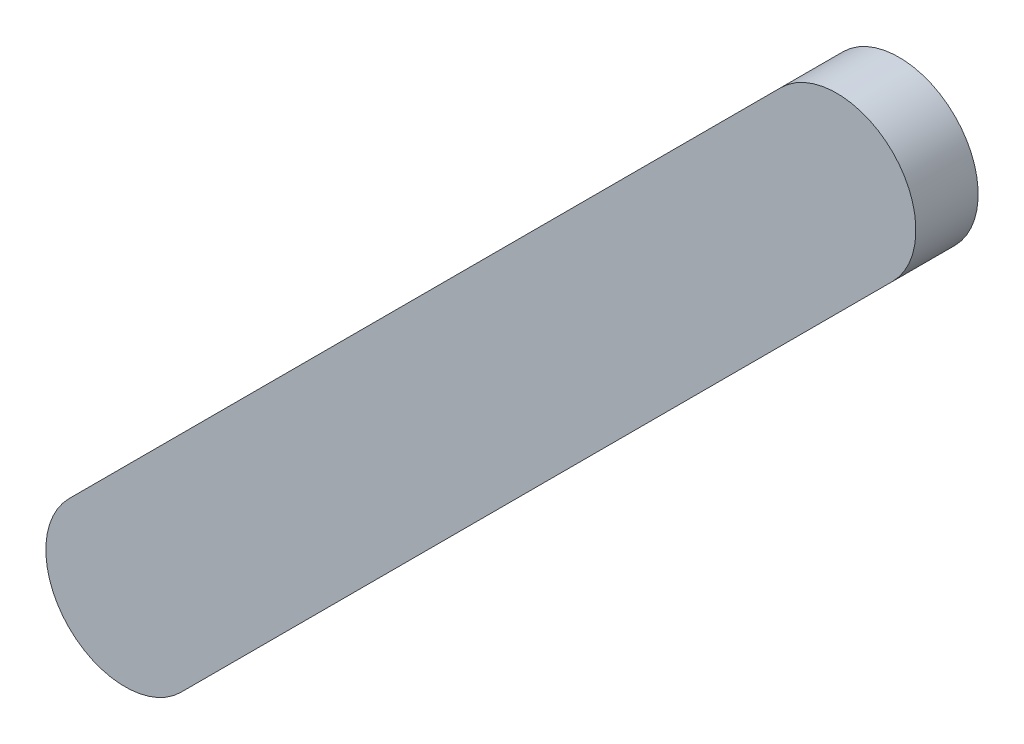
ISO-10303-21;
HEADER;
FILE_DESCRIPTION(('STEP AP214'),'2;1');
FILE_NAME('part.step','',(''),(''),'','','');
FILE_SCHEMA(('AUTOMOTIVE_DESIGN { 1 0 10303 214 1 1 1 1 }'));
ENDSEC;
DATA;
#1=APPLICATION_CONTEXT('core data for automotive mechanical design processes');
#2=APPLICATION_PROTOCOL_DEFINITION('international standard','automotive_design',2000,#1);
#3=PRODUCT_CONTEXT('',#1,'mechanical');
#4=PRODUCT('Part','Part','',(#3));
#5=PRODUCT_RELATED_PRODUCT_CATEGORY('part','',(#4));
#6=PRODUCT_DEFINITION_FORMATION('','',#4);
#7=PRODUCT_DEFINITION_CONTEXT('part definition',#1,'design');
#8=PRODUCT_DEFINITION('design','',#6,#7);
#9=PRODUCT_DEFINITION_SHAPE('','',#8);
#10=(LENGTH_UNIT() NAMED_UNIT(*) SI_UNIT(.MILLI.,.METRE.));
#11=(NAMED_UNIT(*) PLANE_ANGLE_UNIT() SI_UNIT($,.RADIAN.));
#12=(NAMED_UNIT(*) SI_UNIT($,.STERADIAN.) SOLID_ANGLE_UNIT());
#13=UNCERTAINTY_MEASURE_WITH_UNIT(LENGTH_MEASURE(1.E-05),#10,'distance_accuracy_value','');
#14=(GEOMETRIC_REPRESENTATION_CONTEXT(3) GLOBAL_UNCERTAINTY_ASSIGNED_CONTEXT((#13)) GLOBAL_UNIT_ASSIGNED_CONTEXT((#10,
#11,#12)) REPRESENTATION_CONTEXT('',''));
#15=CARTESIAN_POINT('',(0.,0.,0.));
#16=DIRECTION('',(0.,0.,1.));
#17=DIRECTION('',(1.,0.,0.));
#18=AXIS2_PLACEMENT_3D('',#15,#16,#17);
#19=CARTESIAN_POINT('',(136.57760594,109.31979406,0.));
#20=DIRECTION('',(-0.707106781186545,0.70710678118655,0.));
#21=DIRECTION('',(0.70710678118655,0.707106781186545,0.));
#22=AXIS2_PLACEMENT_3D('',#19,#20,#21);
#23=PLANE('',#22);
#24=DIRECTION('',(0.70710678118655,0.707106781186545,0.));
#25=VECTOR('',#24,1.);
#26=CARTESIAN_POINT('',(136.57760594,109.31979406,0.1999996));
#27=LINE('',#26,#25);
#28=CARTESIAN_POINT('',(136.57760594,109.31979406,0.1999996));
#29=VERTEX_POINT('',#28);
#30=CARTESIAN_POINT('',(138.86360594,111.60579406,0.1999996));
#31=VERTEX_POINT('',#30);
#32=EDGE_CURVE('E11',#29,#31,#27,.T.);
#33=ORIENTED_EDGE('',*,*,#32,.F.);
#34=DIRECTION('',(0.,0.,1.));
#35=VECTOR('',#34,1.);
#36=CARTESIAN_POINT('',(136.57760594,109.31979406,0.));
#37=LINE('',#36,#35);
#38=CARTESIAN_POINT('',(136.57760594,109.31979406,0.));
#39=VERTEX_POINT('',#38);
#40=EDGE_CURVE('E24',#39,#29,#37,.T.);
#41=ORIENTED_EDGE('',*,*,#40,.F.);
#42=DIRECTION('',(0.70710678118655,0.707106781186545,0.));
#43=VECTOR('',#42,1.);
#44=CARTESIAN_POINT('',(136.57760594,109.31979406,0.));
#45=LINE('',#44,#43);
#46=CARTESIAN_POINT('',(138.86360594,111.60579406,0.));
#47=VERTEX_POINT('',#46);
#48=EDGE_CURVE('E75',#39,#47,#45,.T.);
#49=ORIENTED_EDGE('',*,*,#48,.T.);
#50=DIRECTION('',(0.,0.,1.));
#51=VECTOR('',#50,1.);
#52=CARTESIAN_POINT('',(138.86360594,111.60579406,0.));
#53=LINE('',#52,#51);
#54=EDGE_CURVE('E37',#47,#31,#53,.T.);
#55=ORIENTED_EDGE('',*,*,#54,.T.);
#56=EDGE_LOOP('',(#33,#41,#49,#55));
#57=FACE_BOUND('',#56,.T.);
#58=ADVANCED_FACE('F17',(#57),#23,.F.);
#59=CARTESIAN_POINT('',(138.684,111.7854,0.));
#60=DIRECTION('',(0.,0.,-1.));
#61=DIRECTION('',(0.707106781186576,-0.70710678118652,0.));
#62=AXIS2_PLACEMENT_3D('',#59,#60,#61);
#63=CYLINDRICAL_SURFACE('',#62,0.254001156230781);
#64=CARTESIAN_POINT('',(138.684,111.7854,0.1999996));
#65=DIRECTION('',(0.,0.,1.));
#66=DIRECTION('',(0.707106781186576,-0.70710678118652,0.));
#67=AXIS2_PLACEMENT_3D('',#64,#65,#66);
#68=CIRCLE('',#67,0.254001156230781);
#69=CARTESIAN_POINT('',(138.50439406,111.96500594,0.1999996));
#70=VERTEX_POINT('',#69);
#71=EDGE_CURVE('E83',#31,#70,#68,.T.);
#72=ORIENTED_EDGE('',*,*,#71,.F.);
#73=ORIENTED_EDGE('',*,*,#54,.F.);
#74=CARTESIAN_POINT('',(138.684,111.7854,0.));
#75=DIRECTION('',(0.,0.,1.));
#76=DIRECTION('',(0.707106781186576,-0.70710678118652,0.));
#77=AXIS2_PLACEMENT_3D('',#74,#75,#76);
#78=CIRCLE('',#77,0.254001156230781);
#79=CARTESIAN_POINT('',(138.50439406,111.96500594,0.));
#80=VERTEX_POINT('',#79);
#81=EDGE_CURVE('E81',#47,#80,#78,.T.);
#82=ORIENTED_EDGE('',*,*,#81,.T.);
#83=DIRECTION('',(0.,0.,1.));
#84=VECTOR('',#83,1.);
#85=CARTESIAN_POINT('',(138.50439406,111.96500594,0.));
#86=LINE('',#85,#84);
#87=EDGE_CURVE('E67',#80,#70,#86,.T.);
#88=ORIENTED_EDGE('',*,*,#87,.T.);
#89=EDGE_LOOP('',(#72,#73,#82,#88));
#90=FACE_BOUND('',#89,.T.);
#91=ADVANCED_FACE('F89',(#90),#63,.T.);
#92=CARTESIAN_POINT('',(138.50439406,111.96500594,0.));
#93=DIRECTION('',(0.707106781186548,-0.707106781186548,0.));
#94=DIRECTION('',(-0.707106781186548,-0.707106781186548,0.));
#95=AXIS2_PLACEMENT_3D('',#92,#93,#94);
#96=PLANE('',#95);
#97=DIRECTION('',(-0.707106781186548,-0.707106781186548,0.));
#98=VECTOR('',#97,1.);
#99=CARTESIAN_POINT('',(138.50439406,111.96500594,0.1999996));
#100=LINE('',#99,#98);
#101=CARTESIAN_POINT('',(136.21839406,109.67900594,0.1999996));
#102=VERTEX_POINT('',#101);
#103=EDGE_CURVE('E71',#70,#102,#100,.T.);
#104=ORIENTED_EDGE('',*,*,#103,.F.);
#105=ORIENTED_EDGE('',*,*,#87,.F.);
#106=DIRECTION('',(-0.707106781186548,-0.707106781186548,0.));
#107=VECTOR('',#106,1.);
#108=CARTESIAN_POINT('',(138.50439406,111.96500594,0.));
#109=LINE('',#108,#107);
#110=CARTESIAN_POINT('',(136.21839406,109.67900594,0.));
#111=VERTEX_POINT('',#110);
#112=EDGE_CURVE('E63',#80,#111,#109,.T.);
#113=ORIENTED_EDGE('',*,*,#112,.T.);
#114=DIRECTION('',(0.,0.,1.));
#115=VECTOR('',#114,1.);
#116=CARTESIAN_POINT('',(136.21839406,109.67900594,0.));
#117=LINE('',#116,#115);
#118=EDGE_CURVE('E53',#111,#102,#117,.T.);
#119=ORIENTED_EDGE('',*,*,#118,.T.);
#120=EDGE_LOOP('',(#104,#105,#113,#119));
#121=FACE_BOUND('',#120,.T.);
#122=ADVANCED_FACE('F66',(#121),#96,.F.);
#123=CARTESIAN_POINT('',(136.398,109.4994,0.));
#124=DIRECTION('',(0.,0.,-1.));
#125=DIRECTION('',(-0.70710678118652,0.707106781186576,0.));
#126=AXIS2_PLACEMENT_3D('',#123,#124,#125);
#127=CYLINDRICAL_SURFACE('',#126,0.254001156230768);
#128=CARTESIAN_POINT('',(136.398,109.4994,0.1999996));
#129=DIRECTION('',(0.,0.,1.));
#130=DIRECTION('',(-0.70710678118652,0.707106781186576,0.));
#131=AXIS2_PLACEMENT_3D('',#128,#129,#130);
#132=CIRCLE('',#131,0.254001156230768);
#133=EDGE_CURVE('E59',#102,#29,#132,.T.);
#134=ORIENTED_EDGE('',*,*,#133,.F.);
#135=ORIENTED_EDGE('',*,*,#118,.F.);
#136=CARTESIAN_POINT('',(136.398,109.4994,0.));
#137=DIRECTION('',(0.,0.,1.));
#138=DIRECTION('',(-0.70710678118652,0.707106781186576,0.));
#139=AXIS2_PLACEMENT_3D('',#136,#137,#138);
#140=CIRCLE('',#139,0.254001156230768);
#141=EDGE_CURVE('E57',#111,#39,#140,.T.);
#142=ORIENTED_EDGE('',*,*,#141,.T.);
#143=ORIENTED_EDGE('',*,*,#40,.T.);
#144=EDGE_LOOP('',(#134,#135,#142,#143));
#145=FACE_BOUND('',#144,.T.);
#146=ADVANCED_FACE('F55',(#145),#127,.T.);
#147=CARTESIAN_POINT('',(136.57760594,109.31979406,0.));
#148=DIRECTION('',(0.,0.,-1.));
#149=DIRECTION('',(-1.,0.,0.));
#150=AXIS2_PLACEMENT_3D('',#147,#148,#149);
#151=PLANE('',#150);
#152=ORIENTED_EDGE('',*,*,#141,.F.);
#153=ORIENTED_EDGE('',*,*,#112,.F.);
#154=ORIENTED_EDGE('',*,*,#81,.F.);
#155=ORIENTED_EDGE('',*,*,#48,.F.);
#156=EDGE_LOOP('',(#152,#153,#154,#155));
#157=FACE_BOUND('',#156,.T.);
#158=ADVANCED_FACE('F74',(#157),#151,.T.);
#159=CARTESIAN_POINT('',(136.57760594,109.31979406,0.1999996));
#160=DIRECTION('',(0.,0.,-1.));
#161=DIRECTION('',(-1.,0.,0.));
#162=AXIS2_PLACEMENT_3D('',#159,#160,#161);
#163=PLANE('',#162);
#164=ORIENTED_EDGE('',*,*,#32,.T.);
#165=ORIENTED_EDGE('',*,*,#71,.T.);
#166=ORIENTED_EDGE('',*,*,#103,.T.);
#167=ORIENTED_EDGE('',*,*,#133,.T.);
#168=EDGE_LOOP('',(#164,#165,#166,#167));
#169=FACE_BOUND('',#168,.T.);
#170=ADVANCED_FACE('F91',(#169),#163,.F.);
#171=CLOSED_SHELL('',(#58,#91,#122,#146,#158,#170));
#172=MANIFOLD_SOLID_BREP('B1',#171);
#173=ADVANCED_BREP_SHAPE_REPRESENTATION('',(#18,#172),#14);
#174=SHAPE_DEFINITION_REPRESENTATION(#9,#173);
ENDSEC;
END-ISO-10303-21;
